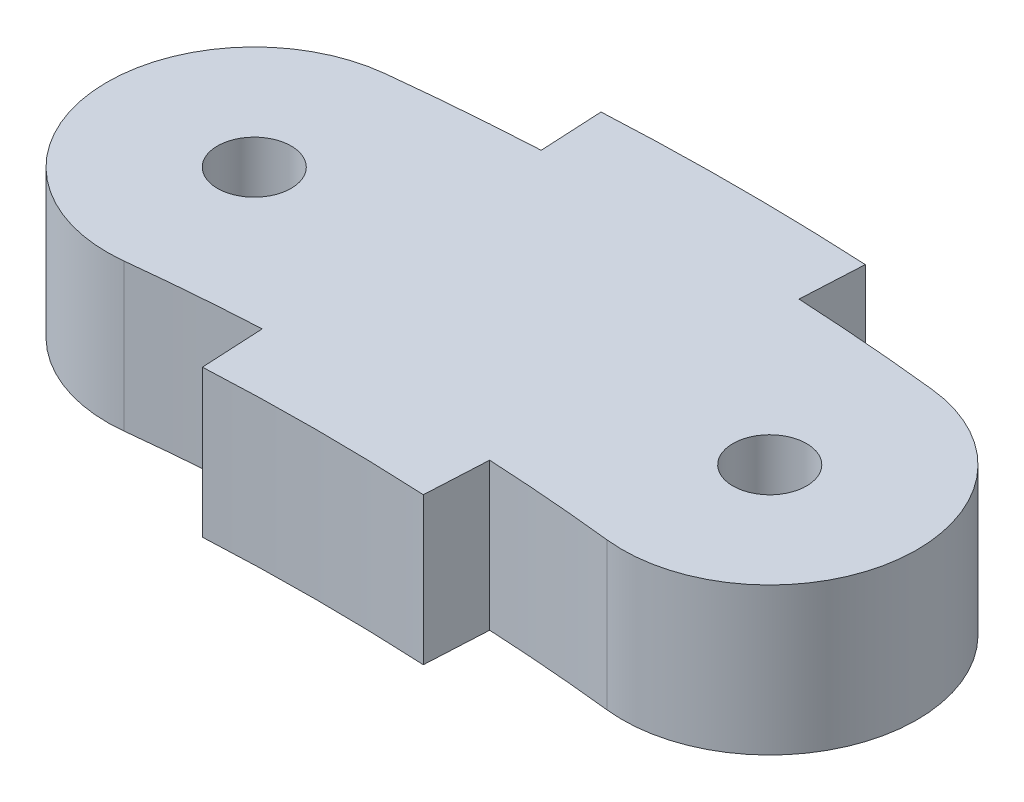
ISO-10303-21;
HEADER;
FILE_DESCRIPTION(('STEP AP214'),'2;1');
FILE_NAME('part.step','',(''),(''),'','','');
FILE_SCHEMA(('AUTOMOTIVE_DESIGN { 1 0 10303 214 1 1 1 1 }'));
ENDSEC;
DATA;
#1=APPLICATION_CONTEXT('core data for automotive mechanical design processes');
#2=APPLICATION_PROTOCOL_DEFINITION('international standard','automotive_design',2000,#1);
#3=PRODUCT_CONTEXT('',#1,'mechanical');
#4=PRODUCT('Part','Part','',(#3));
#5=PRODUCT_RELATED_PRODUCT_CATEGORY('part','',(#4));
#6=PRODUCT_DEFINITION_FORMATION('','',#4);
#7=PRODUCT_DEFINITION_CONTEXT('part definition',#1,'design');
#8=PRODUCT_DEFINITION('design','',#6,#7);
#9=PRODUCT_DEFINITION_SHAPE('','',#8);
#10=(LENGTH_UNIT() NAMED_UNIT(*) SI_UNIT(.MILLI.,.METRE.));
#11=(NAMED_UNIT(*) PLANE_ANGLE_UNIT() SI_UNIT($,.RADIAN.));
#12=(NAMED_UNIT(*) SI_UNIT($,.STERADIAN.) SOLID_ANGLE_UNIT());
#13=UNCERTAINTY_MEASURE_WITH_UNIT(LENGTH_MEASURE(1.E-05),#10,'distance_accuracy_value','');
#14=(GEOMETRIC_REPRESENTATION_CONTEXT(3) GLOBAL_UNCERTAINTY_ASSIGNED_CONTEXT((#13)) GLOBAL_UNIT_ASSIGNED_CONTEXT((#10,
#11,#12)) REPRESENTATION_CONTEXT('',''));
#15=CARTESIAN_POINT('',(0.,0.,0.));
#16=DIRECTION('',(0.,0.,1.));
#17=DIRECTION('',(1.,0.,0.));
#18=AXIS2_PLACEMENT_3D('',#15,#16,#17);
#19=CARTESIAN_POINT('',(0.,-5.,145.52623422));
#20=DIRECTION('',(0.,-1.,0.));
#21=DIRECTION('',(0.,0.,-1.));
#22=AXIS2_PLACEMENT_3D('',#19,#20,#21);
#23=PLANE('',#22);
#24=DIRECTION('',(0.0515370994116555,0.,0.998671080678835));
#25=VECTOR('',#24,1.);
#26=CARTESIAN_POINT('',(-7.5,-5.,0.193392624391275));
#27=LINE('',#26,#25);
#28=CARTESIAN_POINT('',(-7.72096531372747,-5.,-4.08840963401921));
#29=VERTEX_POINT('',#28);
#30=CARTESIAN_POINT('',(-7.5,-5.,0.193392624391275));
#31=VERTEX_POINT('',#30);
#32=EDGE_CURVE('E146',#29,#31,#27,.T.);
#33=ORIENTED_EDGE('',*,*,#32,.F.);
#34=CARTESIAN_POINT('',(0.,-5.,145.52623422));
#35=DIRECTION('',(0.,-1.,0.));
#36=DIRECTION('',(0.,0.,-1.));
#37=AXIS2_PLACEMENT_3D('',#34,#35,#36);
#38=CIRCLE('',#37,149.81373422);
#39=CARTESIAN_POINT('',(-16.4049752147141,-5.,-3.38659850151332));
#40=VERTEX_POINT('',#39);
#41=EDGE_CURVE('E131',#40,#29,#38,.T.);
#42=ORIENTED_EDGE('',*,*,#41,.F.);
#43=CARTESIAN_POINT('',(-17.5,-5.,-13.3264637279442));
#44=DIRECTION('',(0.,1.,0.));
#45=DIRECTION('',(0.,0.,-1.));
#46=AXIS2_PLACEMENT_3D('',#43,#44,#45);
#47=CIRCLE('',#46,10.);
#48=CARTESIAN_POINT('',(-18.595024785286,-5.,-23.2663289543751));
#49=VERTEX_POINT('',#48);
#50=EDGE_CURVE('E144',#49,#40,#47,.T.);
#51=ORIENTED_EDGE('',*,*,#50,.F.);
#52=CARTESIAN_POINT('',(0.,-5.,145.52623422));
#53=DIRECTION('',(0.,1.,0.));
#54=DIRECTION('',(0.,0.,-1.));
#55=AXIS2_PLACEMENT_3D('',#52,#53,#54);
#56=CIRCLE('',#55,169.81373422);
#57=CARTESIAN_POINT('',(-8.75170730196058,-5.,-24.0618312475959));
#58=VERTEX_POINT('',#57);
#59=EDGE_CURVE('E163',#58,#49,#56,.T.);
#60=ORIENTED_EDGE('',*,*,#59,.F.);
#61=CARTESIAN_POINT('',(-8.97267261568805,-5.,-28.3436335060064));
#62=VERTEX_POINT('',#61);
#63=EDGE_CURVE('E205',#62,#58,#27,.T.);
#64=ORIENTED_EDGE('',*,*,#63,.F.);
#65=CARTESIAN_POINT('',(0.,-5.,145.52623422));
#66=DIRECTION('',(0.,1.,0.));
#67=DIRECTION('',(0.,0.,-1.));
#68=AXIS2_PLACEMENT_3D('',#65,#66,#67);
#69=CIRCLE('',#68,174.10123422);
#70=CARTESIAN_POINT('',(8.97267261568805,-5.,-28.3436335060064));
#71=VERTEX_POINT('',#70);
#72=EDGE_CURVE('E187',#71,#62,#69,.T.);
#73=ORIENTED_EDGE('',*,*,#72,.F.);
#74=DIRECTION('',(0.0515370994116555,0.,-0.998671080678835));
#75=VECTOR('',#74,1.);
#76=CARTESIAN_POINT('',(7.5,-5.,0.193392624391275));
#77=LINE('',#76,#75);
#78=CARTESIAN_POINT('',(8.75170730196058,-5.,-24.0618312475959));
#79=VERTEX_POINT('',#78);
#80=EDGE_CURVE('E210',#79,#71,#77,.T.);
#81=ORIENTED_EDGE('',*,*,#80,.F.);
#82=CARTESIAN_POINT('',(18.595024785286,-5.,-23.2663289543751));
#83=VERTEX_POINT('',#82);
#84=EDGE_CURVE('E137',#83,#79,#56,.T.);
#85=ORIENTED_EDGE('',*,*,#84,.F.);
#86=CARTESIAN_POINT('',(17.5,-5.,-13.3264637279442));
#87=DIRECTION('',(0.,1.,0.));
#88=DIRECTION('',(0.,0.,1.));
#89=AXIS2_PLACEMENT_3D('',#86,#87,#88);
#90=CIRCLE('',#89,10.);
#91=CARTESIAN_POINT('',(16.4049752147141,-5.,-3.38659850151332));
#92=VERTEX_POINT('',#91);
#93=EDGE_CURVE('E147',#92,#83,#90,.T.);
#94=ORIENTED_EDGE('',*,*,#93,.F.);
#95=CARTESIAN_POINT('',(7.72096531372747,-5.,-4.08840963401921));
#96=VERTEX_POINT('',#95);
#97=EDGE_CURVE('E148',#96,#92,#38,.T.);
#98=ORIENTED_EDGE('',*,*,#97,.F.);
#99=CARTESIAN_POINT('',(7.49999999999996,-5.,0.193392624391275));
#100=VERTEX_POINT('',#99);
#101=EDGE_CURVE('E192',#100,#96,#77,.T.);
#102=ORIENTED_EDGE('',*,*,#101,.F.);
#103=CARTESIAN_POINT('',(0.,-5.,145.52623422));
#104=DIRECTION('',(0.,-1.,0.));
#105=DIRECTION('',(0.,0.,-1.));
#106=AXIS2_PLACEMENT_3D('',#103,#104,#105);
#107=CIRCLE('',#106,145.52623422);
#108=EDGE_CURVE('E208',#31,#100,#107,.T.);
#109=ORIENTED_EDGE('',*,*,#108,.F.);
#110=EDGE_LOOP('',(#33,#42,#51,#60,#64,#73,#81,#85,#94,#98,#102,#109));
#111=FACE_BOUND('',#110,.T.);
#112=CARTESIAN_POINT('',(17.5,-5.,-13.3264637279442));
#113=DIRECTION('',(0.,1.,0.));
#114=DIRECTION('',(0.,0.,1.));
#115=AXIS2_PLACEMENT_3D('',#112,#113,#114);
#116=CIRCLE('',#115,2.5);
#117=CARTESIAN_POINT('',(17.5,-5.,-10.8264637279442));
#118=VERTEX_POINT('',#117);
#119=EDGE_CURVE('E158',#118,#118,#116,.T.);
#120=ORIENTED_EDGE('',*,*,#119,.T.);
#121=EDGE_LOOP('',(#120));
#122=FACE_BOUND('',#121,.T.);
#123=CARTESIAN_POINT('',(-17.5,-5.,-13.3264637279442));
#124=DIRECTION('',(0.,1.,0.));
#125=DIRECTION('',(0.,0.,1.));
#126=AXIS2_PLACEMENT_3D('',#123,#124,#125);
#127=CIRCLE('',#126,2.5);
#128=CARTESIAN_POINT('',(-17.5,-5.,-10.8264637279442));
#129=VERTEX_POINT('',#128);
#130=EDGE_CURVE('E321',#129,#129,#127,.T.);
#131=ORIENTED_EDGE('',*,*,#130,.T.);
#132=EDGE_LOOP('',(#131));
#133=FACE_BOUND('',#132,.T.);
#134=ADVANCED_FACE('F35',(#111,#122,#133),#23,.T.);
#135=CARTESIAN_POINT('',(-7.5,5.,0.193392624391275));
#136=DIRECTION('',(0.998671080678835,0.,-0.0515370994116555));
#137=DIRECTION('',(-0.0515370994116555,0.,-0.998671080678835));
#138=AXIS2_PLACEMENT_3D('',#135,#136,#137);
#139=PLANE('',#138);
#140=ORIENTED_EDGE('',*,*,#63,.T.);
#141=DIRECTION('',(0.,1.,0.));
#142=VECTOR('',#141,1.);
#143=CARTESIAN_POINT('',(-8.75170730196058,-5.,-24.0618312475959));
#144=LINE('',#143,#142);
#145=CARTESIAN_POINT('',(-8.75170730196058,5.,-24.0618312475959));
#146=VERTEX_POINT('',#145);
#147=EDGE_CURVE('E184',#58,#146,#144,.T.);
#148=ORIENTED_EDGE('',*,*,#147,.T.);
#149=DIRECTION('',(0.0515370994116555,0.,0.998671080678835));
#150=VECTOR('',#149,1.);
#151=CARTESIAN_POINT('',(-7.5,5.,0.193392624391275));
#152=LINE('',#151,#150);
#153=CARTESIAN_POINT('',(-8.97267261568805,5.,-28.3436335060064));
#154=VERTEX_POINT('',#153);
#155=EDGE_CURVE('E193',#154,#146,#152,.T.);
#156=ORIENTED_EDGE('',*,*,#155,.F.);
#157=DIRECTION('',(0.,-1.,0.));
#158=VECTOR('',#157,1.);
#159=CARTESIAN_POINT('',(-8.97267261568805,5.,-28.3436335060064));
#160=LINE('',#159,#158);
#161=EDGE_CURVE('E11',#154,#62,#160,.T.);
#162=ORIENTED_EDGE('',*,*,#161,.T.);
#163=EDGE_LOOP('',(#140,#148,#156,#162));
#164=FACE_BOUND('',#163,.T.);
#165=ADVANCED_FACE('F235',(#164),#139,.F.);
#166=CARTESIAN_POINT('',(7.5,5.,0.193392624391275));
#167=DIRECTION('',(-0.998671080678835,0.,-0.0515370994116555));
#168=DIRECTION('',(-0.0515370994116555,0.,0.998671080678835));
#169=AXIS2_PLACEMENT_3D('',#166,#167,#168);
#170=PLANE('',#169);
#171=DIRECTION('',(0.0515370994116555,0.,-0.998671080678835));
#172=VECTOR('',#171,1.);
#173=CARTESIAN_POINT('',(7.5,5.,0.193392624391275));
#174=LINE('',#173,#172);
#175=CARTESIAN_POINT('',(8.75170730196058,5.,-24.0618312475959));
#176=VERTEX_POINT('',#175);
#177=CARTESIAN_POINT('',(8.97267261568805,5.,-28.3436335060064));
#178=VERTEX_POINT('',#177);
#179=EDGE_CURVE('E198',#176,#178,#174,.T.);
#180=ORIENTED_EDGE('',*,*,#179,.F.);
#181=DIRECTION('',(0.,1.,0.));
#182=VECTOR('',#181,1.);
#183=CARTESIAN_POINT('',(8.75170730196058,-5.,-24.0618312475959));
#184=LINE('',#183,#182);
#185=EDGE_CURVE('E181',#176,#79,#184,.F.);
#186=ORIENTED_EDGE('',*,*,#185,.T.);
#187=ORIENTED_EDGE('',*,*,#80,.T.);
#188=DIRECTION('',(0.,-1.,0.));
#189=VECTOR('',#188,1.);
#190=CARTESIAN_POINT('',(8.97267261568805,5.,-28.3436335060064));
#191=LINE('',#190,#189);
#192=EDGE_CURVE('E202',#178,#71,#191,.T.);
#193=ORIENTED_EDGE('',*,*,#192,.F.);
#194=EDGE_LOOP('',(#180,#186,#187,#193));
#195=FACE_BOUND('',#194,.T.);
#196=ADVANCED_FACE('F241',(#195),#170,.F.);
#197=CARTESIAN_POINT('',(0.,5.,145.52623422));
#198=DIRECTION('',(0.,-1.,0.));
#199=DIRECTION('',(0.,0.,-1.));
#200=AXIS2_PLACEMENT_3D('',#197,#198,#199);
#201=CYLINDRICAL_SURFACE('',#200,174.10123422);
#202=CARTESIAN_POINT('',(2.5,0.,-28.5570497475518));
#203=CARTESIAN_POINT('',(2.49999377551294,0.140418330500894,-28.5570499901962));
#204=CARTESIAN_POINT('',(2.48812991610431,0.280938293282168,-28.5572214675525));
#205=CARTESIAN_POINT('',(2.44096755833609,0.558107692997247,-28.5578890338705));
#206=CARTESIAN_POINT('',(2.40564090188692,0.694752273313537,-28.5583855128616));
#207=CARTESIAN_POINT('',(2.31255930396923,0.960115343929164,-28.5596468287782));
#208=CARTESIAN_POINT('',(2.25481513463183,1.08883760671878,-28.5604115367965));
#209=CARTESIAN_POINT('',(2.11855260320089,1.33472477731036,-28.5621229776841));
#210=CARTESIAN_POINT('',(2.04003938514421,1.45189253705767,-28.5630696654653));
#211=CARTESIAN_POINT('',(1.86444561312543,1.67140650377812,-28.5650386425776));
#212=CARTESIAN_POINT('',(1.76736192259709,1.77375020181786,-28.5660609446622));
#213=CARTESIAN_POINT('',(1.5573867021884,1.96069039645708,-28.5680658115183));
#214=CARTESIAN_POINT('',(1.44449454981516,2.04528619386614,-28.569048374723));
#215=CARTESIAN_POINT('',(1.20610628474581,2.19432643181454,-28.5708629739851));
#216=CARTESIAN_POINT('',(1.0806098627555,2.25877037769107,-28.5716950063471));
#217=CARTESIAN_POINT('',(0.820577853294998,2.3656739422612,-28.5731147063998));
#218=CARTESIAN_POINT('',(0.6860422881373,2.40813361521921,-28.5737023746936));
#219=CARTESIAN_POINT('',(0.411760550377798,2.46986073982475,-28.5745670602259));
#220=CARTESIAN_POINT('',(0.272014732780736,2.48912976861902,-28.5748440985896));
#221=CARTESIAN_POINT('',(-0.00872839281257378,2.50393344980575,-28.5750563620433));
#222=CARTESIAN_POINT('',(-0.149725697925476,2.49946815686638,-28.5749915879207));
#223=CARTESIAN_POINT('',(-0.428958647919069,2.46693138686529,-28.5745275484519));
#224=CARTESIAN_POINT('',(-0.56719449478049,2.43886164281866,-28.574128307662));
#225=CARTESIAN_POINT('',(-0.836991602093442,2.35991543111861,-28.5730403703524));
#226=CARTESIAN_POINT('',(-0.968552853745247,2.30903893339783,-28.5723516734512));
#227=CARTESIAN_POINT('',(-1.22127160293703,2.18592145006987,-28.5707624210771));
#228=CARTESIAN_POINT('',(-1.34242871360763,2.11367967045584,-28.5698618577308));
#229=CARTESIAN_POINT('',(-1.57089563220674,1.94988296054732,-28.5679503951332));
#230=CARTESIAN_POINT('',(-1.67820543720312,1.85832802616333,-28.5669394958584));
#231=CARTESIAN_POINT('',(-1.87594174694973,1.65849408954525,-28.5649212139569));
#232=CARTESIAN_POINT('',(-1.96636672459858,1.55021357622923,-28.5639138316563));
#233=CARTESIAN_POINT('',(-2.12775475009575,1.32000755644447,-28.5620162499632));
#234=CARTESIAN_POINT('',(-2.19871779527737,1.19808204810606,-28.5611260505867));
#235=CARTESIAN_POINT('',(-2.31916734131849,0.944046307648135,-28.5595632077082));
#236=CARTESIAN_POINT('',(-2.36865379683236,0.811936054025258,-28.5588905646655));
#237=CARTESIAN_POINT('',(-2.44474443261169,0.541281402551807,-28.5578386926924));
#238=CARTESIAN_POINT('',(-2.47134862794374,0.402737008937786,-28.5574594635689));
#239=CARTESIAN_POINT('',(-2.50091767056486,0.123160183364877,-28.5570372088107));
#240=CARTESIAN_POINT('',(-2.50388462941387,-0.0178720252246162,-28.556994153145));
#241=CARTESIAN_POINT('',(-2.48610047528906,-0.29843266149827,-28.5572490212684));
#242=CARTESIAN_POINT('',(-2.46534936778176,-0.437961089529013,-28.5575469449788));
#243=CARTESIAN_POINT('',(-2.40071988596314,-0.711547508868861,-28.5584501568158));
#244=CARTESIAN_POINT('',(-2.35684246750863,-0.845605726026034,-28.559055432239));
#245=CARTESIAN_POINT('',(-2.24720688342412,-1.10445313825877,-28.5605050980802));
#246=CARTESIAN_POINT('',(-2.18144870988593,-1.22924232998428,-28.5613494885847));
#247=CARTESIAN_POINT('',(-2.02991284058702,-1.46601904719194,-28.5631822618318));
#248=CARTESIAN_POINT('',(-1.94413372307454,-1.57800566268007,-28.5641706547985));
#249=CARTESIAN_POINT('',(-1.75499302960464,-1.7859891749517,-28.566179965811));
#250=CARTESIAN_POINT('',(-1.65163143789282,-1.88198605740778,-28.567200883886));
#251=CARTESIAN_POINT('',(-1.43025086960687,-2.05527205488593,-28.5691602343703));
#252=CARTESIAN_POINT('',(-1.31223082438986,-2.13255980474641,-28.5700986607573));
#253=CARTESIAN_POINT('',(-1.06488914609038,-2.2662241915353,-28.5717871446295));
#254=CARTESIAN_POINT('',(-0.935567528048872,-2.32260085629318,-28.5725372023654));
#255=CARTESIAN_POINT('',(-0.669298855466579,-2.41284039992506,-28.5737643606336));
#256=CARTESIAN_POINT('',(-0.53235210346034,-2.44670417133097,-28.5742414719869));
#257=CARTESIAN_POINT('',(-0.254716152200741,-2.49095960427492,-28.5748689920594));
#258=CARTESIAN_POINT('',(-0.114026948498721,-2.50135123791031,-28.5750194003902));
#259=CARTESIAN_POINT('',(0.167086160887033,-2.49836722617772,-28.5749765570192));
#260=CARTESIAN_POINT('',(0.307510089727796,-2.4849937613964,-28.5747833368472));
#261=CARTESIAN_POINT('',(0.584119618434835,-2.434863600715,-28.5740750790014));
#262=CARTESIAN_POINT('',(0.720305209802226,-2.398106857929,-28.5735600406822));
#263=CARTESIAN_POINT('',(0.984574697231847,-2.30225318174905,-28.5722661909205));
#264=CARTESIAN_POINT('',(1.11265844420197,-2.24315583737747,-28.5714873746255));
#265=CARTESIAN_POINT('',(1.35708185455036,-2.10430121896847,-28.5697537933672));
#266=CARTESIAN_POINT('',(1.47342197046439,-2.02454474144454,-28.5687990351878));
#267=CARTESIAN_POINT('',(1.69106104708946,-1.84663689102714,-28.5668211707911));
#268=CARTESIAN_POINT('',(1.79236022856994,-1.74848578817613,-28.5657980655772));
#269=CARTESIAN_POINT('',(1.97706885114908,-1.53654151956128,-28.563798558287));
#270=CARTESIAN_POINT('',(2.06047384338581,-1.42274447540823,-28.5628221678717));
#271=CARTESIAN_POINT('',(2.20703015992689,-1.18271318039988,-28.5610259866248));
#272=CARTESIAN_POINT('',(2.27017100268337,-1.05647253712807,-28.560206276924));
#273=CARTESIAN_POINT('',(2.37428941574535,-0.795280011505881,-28.5588175325567));
#274=CARTESIAN_POINT('',(2.41529352359666,-0.660338777755685,-28.5582481978929));
#275=CARTESIAN_POINT('',(2.4630602040144,-0.437116066405006,-28.5575772149113));
#276=CARTESIAN_POINT('',(2.47689530695929,-0.350284692523686,-28.557380268417));
#277=CARTESIAN_POINT('',(2.49536715163534,-0.175648804080643,-28.5571164588436));
#278=CARTESIAN_POINT('',(2.50000389397625,-0.0878442895834297,-28.557049595756));
#279=CARTESIAN_POINT('',(2.5,0.,-28.5570497475518));
#280=B_SPLINE_CURVE_WITH_KNOTS('',3,(#202,#203,#204,#205,#206,#207,#208,#209,#210,#211,#212,
#213,#214,#215,#216,#217,#218,#219,#220,#221,#222,#223,#224,#225,#226,#227,#228,#229,#230,#231,
#232,#233,#234,#235,#236,#237,#238,#239,#240,#241,#242,#243,#244,#245,#246,#247,#248,#249,#250,
#251,#252,#253,#254,#255,#256,#257,#258,#259,#260,#261,#262,#263,#264,#265,#266,#267,#268,#269,
#270,#271,#272,#273,#274,#275,#276,#277,#278,#279),.UNSPECIFIED.,.T.,.F.,(4,2,2,2,2,2,2,2,2,2,2,
2,2,2,2,2,2,2,2,2,2,2,2,2,2,2,2,2,2,2,2,2,2,2,2,2,2,2,4),(0.,0.420934357419994,
0.842374800129753,1.26361298116407,1.68474692828661,2.10595206814499,2.52717379854675,
2.94840586776873,3.36963689724662,3.7908392780727,4.21204068872752,4.63321117789716,
5.05438222231977,5.47556892086425,5.89675570859372,6.317980570963,6.73920549104909,
7.1604313005045,7.58165683260815,8.00284473540025,8.42403254111712,8.84520293966228,
9.26637349042777,9.68757395897625,10.1087748049343,10.5300063756736,10.9512373858153,
11.3724516951028,11.793666505111,12.2148426681944,12.6360196757826,13.0572044317188,
13.478372951281,13.8995352883592,14.3208022139904,14.7422866883288,15.1632647581814,
15.4265970589435,15.6899293422496),.UNSPECIFIED.);
#281=CARTESIAN_POINT('',(2.5,0.,-28.5570497475518));
#282=VERTEX_POINT('',#281);
#283=EDGE_CURVE('E40',#282,#282,#280,.T.);
#284=ORIENTED_EDGE('',*,*,#283,.T.);
#285=EDGE_LOOP('',(#284));
#286=FACE_BOUND('',#285,.T.);
#287=ORIENTED_EDGE('',*,*,#72,.T.);
#288=ORIENTED_EDGE('',*,*,#161,.F.);
#289=CARTESIAN_POINT('',(0.,5.,145.52623422));
#290=DIRECTION('',(0.,1.,0.));
#291=DIRECTION('',(0.,0.,-1.));
#292=AXIS2_PLACEMENT_3D('',#289,#290,#291);
#293=CIRCLE('',#292,174.10123422);
#294=EDGE_CURVE('E188',#178,#154,#293,.T.);
#295=ORIENTED_EDGE('',*,*,#294,.F.);
#296=ORIENTED_EDGE('',*,*,#192,.T.);
#297=EDGE_LOOP('',(#287,#288,#295,#296));
#298=FACE_BOUND('',#297,.T.);
#299=ADVANCED_FACE('F37',(#286,#298),#201,.T.);
#300=CARTESIAN_POINT('',(-7.72096531372747,5.,-4.08840963401919));
#301=VERTEX_POINT('',#300);
#302=CARTESIAN_POINT('',(-7.5,5.,0.193392624391275));
#303=VERTEX_POINT('',#302);
#304=EDGE_CURVE('E191',#301,#303,#152,.T.);
#305=ORIENTED_EDGE('',*,*,#304,.F.);
#306=DIRECTION('',(0.,1.,0.));
#307=VECTOR('',#306,1.);
#308=CARTESIAN_POINT('',(-7.72096531372747,-5.,-4.08840963401921));
#309=LINE('',#308,#307);
#310=EDGE_CURVE('E179',#301,#29,#309,.F.);
#311=ORIENTED_EDGE('',*,*,#310,.T.);
#312=ORIENTED_EDGE('',*,*,#32,.T.);
#313=DIRECTION('',(0.,-1.,0.));
#314=VECTOR('',#313,1.);
#315=CARTESIAN_POINT('',(-7.5,5.,0.193392624391275));
#316=LINE('',#315,#314);
#317=EDGE_CURVE('E48',#303,#31,#316,.T.);
#318=ORIENTED_EDGE('',*,*,#317,.F.);
#319=EDGE_LOOP('',(#305,#311,#312,#318));
#320=FACE_BOUND('',#319,.T.);
#321=ADVANCED_FACE('F233',(#320),#139,.F.);
#322=CARTESIAN_POINT('',(0.,5.,145.52623422));
#323=DIRECTION('',(0.,-1.,0.));
#324=DIRECTION('',(0.,0.,-1.));
#325=AXIS2_PLACEMENT_3D('',#322,#323,#324);
#326=CYLINDRICAL_SURFACE('',#325,145.52623422);
#327=ORIENTED_EDGE('',*,*,#108,.T.);
#328=DIRECTION('',(0.,-1.,0.));
#329=VECTOR('',#328,1.);
#330=CARTESIAN_POINT('',(7.49999999999996,5.,0.193392624391275));
#331=LINE('',#330,#329);
#332=CARTESIAN_POINT('',(7.49999999999996,5.,0.193392624391275));
#333=VERTEX_POINT('',#332);
#334=EDGE_CURVE('E215',#333,#100,#331,.T.);
#335=ORIENTED_EDGE('',*,*,#334,.F.);
#336=CARTESIAN_POINT('',(0.,5.,145.52623422));
#337=DIRECTION('',(0.,-1.,0.));
#338=DIRECTION('',(0.,0.,-1.));
#339=AXIS2_PLACEMENT_3D('',#336,#337,#338);
#340=CIRCLE('',#339,145.52623422);
#341=EDGE_CURVE('E196',#303,#333,#340,.T.);
#342=ORIENTED_EDGE('',*,*,#341,.F.);
#343=ORIENTED_EDGE('',*,*,#317,.T.);
#344=EDGE_LOOP('',(#327,#335,#342,#343));
#345=FACE_BOUND('',#344,.T.);
#346=ADVANCED_FACE('F222',(#345),#326,.F.);
#347=ORIENTED_EDGE('',*,*,#101,.T.);
#348=DIRECTION('',(0.,1.,0.));
#349=VECTOR('',#348,1.);
#350=CARTESIAN_POINT('',(7.72096531372747,-5.,-4.08840963401921));
#351=LINE('',#350,#349);
#352=CARTESIAN_POINT('',(7.72096531372747,5.,-4.08840963401921));
#353=VERTEX_POINT('',#352);
#354=EDGE_CURVE('E172',#96,#353,#351,.T.);
#355=ORIENTED_EDGE('',*,*,#354,.T.);
#356=EDGE_CURVE('E199',#333,#353,#174,.T.);
#357=ORIENTED_EDGE('',*,*,#356,.F.);
#358=ORIENTED_EDGE('',*,*,#334,.T.);
#359=EDGE_LOOP('',(#347,#355,#357,#358));
#360=FACE_BOUND('',#359,.T.);
#361=ADVANCED_FACE('F230',(#360),#170,.F.);
#362=CARTESIAN_POINT('',(0.,5.,145.52623422));
#363=DIRECTION('',(0.,-1.,0.));
#364=DIRECTION('',(0.,0.,-1.));
#365=AXIS2_PLACEMENT_3D('',#362,#363,#364);
#366=PLANE('',#365);
#367=CARTESIAN_POINT('',(-17.5,5.,-13.3264637279442));
#368=DIRECTION('',(0.,1.,0.));
#369=DIRECTION('',(0.,0.,1.));
#370=AXIS2_PLACEMENT_3D('',#367,#368,#369);
#371=CIRCLE('',#370,2.49999999999999);
#372=CARTESIAN_POINT('',(-17.5,5.,-10.8264637279442));
#373=VERTEX_POINT('',#372);
#374=EDGE_CURVE('E317',#373,#373,#371,.T.);
#375=ORIENTED_EDGE('',*,*,#374,.F.);
#376=EDGE_LOOP('',(#375));
#377=FACE_BOUND('',#376,.T.);
#378=CARTESIAN_POINT('',(17.5,5.,-13.3264637279442));
#379=DIRECTION('',(0.,1.,0.));
#380=DIRECTION('',(0.,0.,1.));
#381=AXIS2_PLACEMENT_3D('',#378,#379,#380);
#382=CIRCLE('',#381,2.49999999999999);
#383=CARTESIAN_POINT('',(17.5,5.,-10.8264637279442));
#384=VERTEX_POINT('',#383);
#385=EDGE_CURVE('E323',#384,#384,#382,.T.);
#386=ORIENTED_EDGE('',*,*,#385,.F.);
#387=EDGE_LOOP('',(#386));
#388=FACE_BOUND('',#387,.T.);
#389=ORIENTED_EDGE('',*,*,#356,.T.);
#390=CARTESIAN_POINT('',(0.,5.,145.52623422));
#391=DIRECTION('',(0.,-1.,0.));
#392=DIRECTION('',(0.,0.,-1.));
#393=AXIS2_PLACEMENT_3D('',#390,#391,#392);
#394=CIRCLE('',#393,149.81373422);
#395=CARTESIAN_POINT('',(16.4049752147141,5.,-3.38659850151332));
#396=VERTEX_POINT('',#395);
#397=EDGE_CURVE('E167',#353,#396,#394,.T.);
#398=ORIENTED_EDGE('',*,*,#397,.T.);
#399=CARTESIAN_POINT('',(17.5,5.,-13.3264637279442));
#400=DIRECTION('',(0.,1.,0.));
#401=DIRECTION('',(0.,0.,1.));
#402=AXIS2_PLACEMENT_3D('',#399,#400,#401);
#403=CIRCLE('',#402,10.);
#404=CARTESIAN_POINT('',(18.595024785286,5.,-23.2663289543751));
#405=VERTEX_POINT('',#404);
#406=EDGE_CURVE('E169',#396,#405,#403,.T.);
#407=ORIENTED_EDGE('',*,*,#406,.T.);
#408=CARTESIAN_POINT('',(0.,5.,145.52623422));
#409=DIRECTION('',(0.,1.,0.));
#410=DIRECTION('',(0.,0.,-1.));
#411=AXIS2_PLACEMENT_3D('',#408,#409,#410);
#412=CIRCLE('',#411,169.81373422);
#413=EDGE_CURVE('E55',#405,#176,#412,.T.);
#414=ORIENTED_EDGE('',*,*,#413,.T.);
#415=ORIENTED_EDGE('',*,*,#179,.T.);
#416=ORIENTED_EDGE('',*,*,#294,.T.);
#417=ORIENTED_EDGE('',*,*,#155,.T.);
#418=CARTESIAN_POINT('',(-18.595024785286,5.,-23.2663289543751));
#419=VERTEX_POINT('',#418);
#420=EDGE_CURVE('E155',#146,#419,#412,.T.);
#421=ORIENTED_EDGE('',*,*,#420,.T.);
#422=CARTESIAN_POINT('',(-17.5,5.,-13.3264637279442));
#423=DIRECTION('',(0.,1.,0.));
#424=DIRECTION('',(0.,0.,-1.));
#425=AXIS2_PLACEMENT_3D('',#422,#423,#424);
#426=CIRCLE('',#425,10.);
#427=CARTESIAN_POINT('',(-16.4049752147141,5.,-3.38659850151332));
#428=VERTEX_POINT('',#427);
#429=EDGE_CURVE('E165',#419,#428,#426,.T.);
#430=ORIENTED_EDGE('',*,*,#429,.T.);
#431=EDGE_CURVE('E62',#428,#301,#394,.T.);
#432=ORIENTED_EDGE('',*,*,#431,.T.);
#433=ORIENTED_EDGE('',*,*,#304,.T.);
#434=ORIENTED_EDGE('',*,*,#341,.T.);
#435=EDGE_LOOP('',(#389,#398,#407,#414,#415,#416,#417,#421,#430,#432,#433,#434));
#436=FACE_BOUND('',#435,.T.);
#437=ADVANCED_FACE('F232',(#377,#388,#436),#366,.F.);
#438=CARTESIAN_POINT('',(17.5,-5.,-13.3264637279442));
#439=DIRECTION('',(0.,1.,0.));
#440=DIRECTION('',(0.,0.,1.));
#441=AXIS2_PLACEMENT_3D('',#438,#439,#440);
#442=CYLINDRICAL_SURFACE('',#441,10.);
#443=ORIENTED_EDGE('',*,*,#406,.F.);
#444=DIRECTION('',(0.,1.,0.));
#445=VECTOR('',#444,1.);
#446=CARTESIAN_POINT('',(16.4049752147141,-5.,-3.38659850151332));
#447=LINE('',#446,#445);
#448=EDGE_CURVE('E136',#92,#396,#447,.T.);
#449=ORIENTED_EDGE('',*,*,#448,.F.);
#450=ORIENTED_EDGE('',*,*,#93,.T.);
#451=DIRECTION('',(0.,1.,0.));
#452=VECTOR('',#451,1.);
#453=CARTESIAN_POINT('',(18.595024785286,-5.,-23.2663289543751));
#454=LINE('',#453,#452);
#455=EDGE_CURVE('E173',#83,#405,#454,.T.);
#456=ORIENTED_EDGE('',*,*,#455,.T.);
#457=EDGE_LOOP('',(#443,#449,#450,#456));
#458=FACE_BOUND('',#457,.T.);
#459=ADVANCED_FACE('F256',(#458),#442,.T.);
#460=CARTESIAN_POINT('',(0.,-5.,145.52623422));
#461=DIRECTION('',(0.,1.,0.));
#462=DIRECTION('',(0.,0.,1.));
#463=AXIS2_PLACEMENT_3D('',#460,#461,#462);
#464=CYLINDRICAL_SURFACE('',#463,149.81373422);
#465=ORIENTED_EDGE('',*,*,#354,.F.);
#466=ORIENTED_EDGE('',*,*,#97,.T.);
#467=ORIENTED_EDGE('',*,*,#448,.T.);
#468=ORIENTED_EDGE('',*,*,#397,.F.);
#469=EDGE_LOOP('',(#465,#466,#467,#468));
#470=FACE_BOUND('',#469,.T.);
#471=ADVANCED_FACE('F278',(#470),#464,.F.);
#472=CARTESIAN_POINT('',(0.,-5.,145.52623422));
#473=DIRECTION('',(0.,1.,0.));
#474=DIRECTION('',(0.,0.,1.));
#475=AXIS2_PLACEMENT_3D('',#472,#473,#474);
#476=CYLINDRICAL_SURFACE('',#475,169.81373422);
#477=ORIENTED_EDGE('',*,*,#185,.F.);
#478=ORIENTED_EDGE('',*,*,#413,.F.);
#479=ORIENTED_EDGE('',*,*,#455,.F.);
#480=ORIENTED_EDGE('',*,*,#84,.T.);
#481=EDGE_LOOP('',(#477,#478,#479,#480));
#482=FACE_BOUND('',#481,.T.);
#483=ADVANCED_FACE('F273',(#482),#476,.T.);
#484=ORIENTED_EDGE('',*,*,#147,.F.);
#485=ORIENTED_EDGE('',*,*,#59,.T.);
#486=DIRECTION('',(0.,1.,0.));
#487=VECTOR('',#486,1.);
#488=CARTESIAN_POINT('',(-18.595024785286,-5.,-23.2663289543751));
#489=LINE('',#488,#487);
#490=EDGE_CURVE('E153',#49,#419,#489,.T.);
#491=ORIENTED_EDGE('',*,*,#490,.T.);
#492=ORIENTED_EDGE('',*,*,#420,.F.);
#493=EDGE_LOOP('',(#484,#485,#491,#492));
#494=FACE_BOUND('',#493,.T.);
#495=ADVANCED_FACE('F270',(#494),#476,.T.);
#496=ORIENTED_EDGE('',*,*,#310,.F.);
#497=ORIENTED_EDGE('',*,*,#431,.F.);
#498=DIRECTION('',(0.,1.,0.));
#499=VECTOR('',#498,1.);
#500=CARTESIAN_POINT('',(-16.4049752147141,-5.,-3.38659850151332));
#501=LINE('',#500,#499);
#502=EDGE_CURVE('E128',#40,#428,#501,.T.);
#503=ORIENTED_EDGE('',*,*,#502,.F.);
#504=ORIENTED_EDGE('',*,*,#41,.T.);
#505=EDGE_LOOP('',(#496,#497,#503,#504));
#506=FACE_BOUND('',#505,.T.);
#507=ADVANCED_FACE('F130',(#506),#464,.F.);
#508=CARTESIAN_POINT('',(-17.5,-5.,-13.3264637279442));
#509=DIRECTION('',(0.,1.,0.));
#510=DIRECTION('',(0.,0.,1.));
#511=AXIS2_PLACEMENT_3D('',#508,#509,#510);
#512=CYLINDRICAL_SURFACE('',#511,10.);
#513=ORIENTED_EDGE('',*,*,#429,.F.);
#514=ORIENTED_EDGE('',*,*,#490,.F.);
#515=ORIENTED_EDGE('',*,*,#50,.T.);
#516=ORIENTED_EDGE('',*,*,#502,.T.);
#517=EDGE_LOOP('',(#513,#514,#515,#516));
#518=FACE_BOUND('',#517,.T.);
#519=ADVANCED_FACE('F151',(#518),#512,.T.);
#520=CARTESIAN_POINT('',(17.5,5.,-13.3264637279442));
#521=DIRECTION('',(0.,1.,0.));
#522=DIRECTION('',(0.,0.,1.));
#523=AXIS2_PLACEMENT_3D('',#520,#521,#522);
#524=CYLINDRICAL_SURFACE('',#523,2.49999999999999);
#525=ORIENTED_EDGE('',*,*,#119,.F.);
#526=EDGE_LOOP('',(#525));
#527=FACE_BOUND('',#526,.T.);
#528=ORIENTED_EDGE('',*,*,#385,.T.);
#529=EDGE_LOOP('',(#528));
#530=FACE_BOUND('',#529,.T.);
#531=ADVANCED_FACE('F292',(#527,#530),#524,.F.);
#532=CARTESIAN_POINT('',(-17.5,5.,-13.3264637279442));
#533=DIRECTION('',(0.,1.,0.));
#534=DIRECTION('',(0.,0.,1.));
#535=AXIS2_PLACEMENT_3D('',#532,#533,#534);
#536=CYLINDRICAL_SURFACE('',#535,2.49999999999999);
#537=ORIENTED_EDGE('',*,*,#130,.F.);
#538=EDGE_LOOP('',(#537));
#539=FACE_BOUND('',#538,.T.);
#540=ORIENTED_EDGE('',*,*,#374,.T.);
#541=EDGE_LOOP('',(#540));
#542=FACE_BOUND('',#541,.T.);
#543=ADVANCED_FACE('F298',(#539,#542),#536,.F.);
#544=CARTESIAN_POINT('',(0.,0.,-30.));
#545=DIRECTION('',(0.,0.,1.));
#546=DIRECTION('',(1.,0.,0.));
#547=AXIS2_PLACEMENT_3D('',#544,#545,#546);
#548=CYLINDRICAL_SURFACE('',#547,2.5);
#549=CARTESIAN_POINT('',(0.,0.,-10.));
#550=DIRECTION('',(0.,0.,1.));
#551=DIRECTION('',(1.,0.,0.));
#552=AXIS2_PLACEMENT_3D('',#549,#550,#551);
#553=CIRCLE('',#552,2.5);
#554=CARTESIAN_POINT('',(2.5,0.,-10.));
#555=VERTEX_POINT('',#554);
#556=EDGE_CURVE('E314',#555,#555,#553,.T.);
#557=ORIENTED_EDGE('',*,*,#556,.T.);
#558=EDGE_LOOP('',(#557));
#559=FACE_BOUND('',#558,.T.);
#560=ORIENTED_EDGE('',*,*,#283,.F.);
#561=EDGE_LOOP('',(#560));
#562=FACE_BOUND('',#561,.T.);
#563=ADVANCED_FACE('F301',(#559,#562),#548,.F.);
#564=CARTESIAN_POINT('',(0.,0.,-10.));
#565=DIRECTION('',(0.,0.,1.));
#566=DIRECTION('',(1.,0.,0.));
#567=AXIS2_PLACEMENT_3D('',#564,#565,#566);
#568=PLANE('',#567);
#569=ORIENTED_EDGE('',*,*,#556,.F.);
#570=EDGE_LOOP('',(#569));
#571=FACE_BOUND('',#570,.T.);
#572=ADVANCED_FACE('F306',(#571),#568,.F.);
#573=CLOSED_SHELL('',(#134,#165,#196,#299,#321,#346,#361,#437,#459,#471,#483,#495,#507,#519,
#531,#543,#563,#572));
#574=MANIFOLD_SOLID_BREP('B2',#573);
#575=ADVANCED_BREP_SHAPE_REPRESENTATION('',(#18,#574),#14);
#576=SHAPE_DEFINITION_REPRESENTATION(#9,#575);
ENDSEC;
END-ISO-10303-21;
